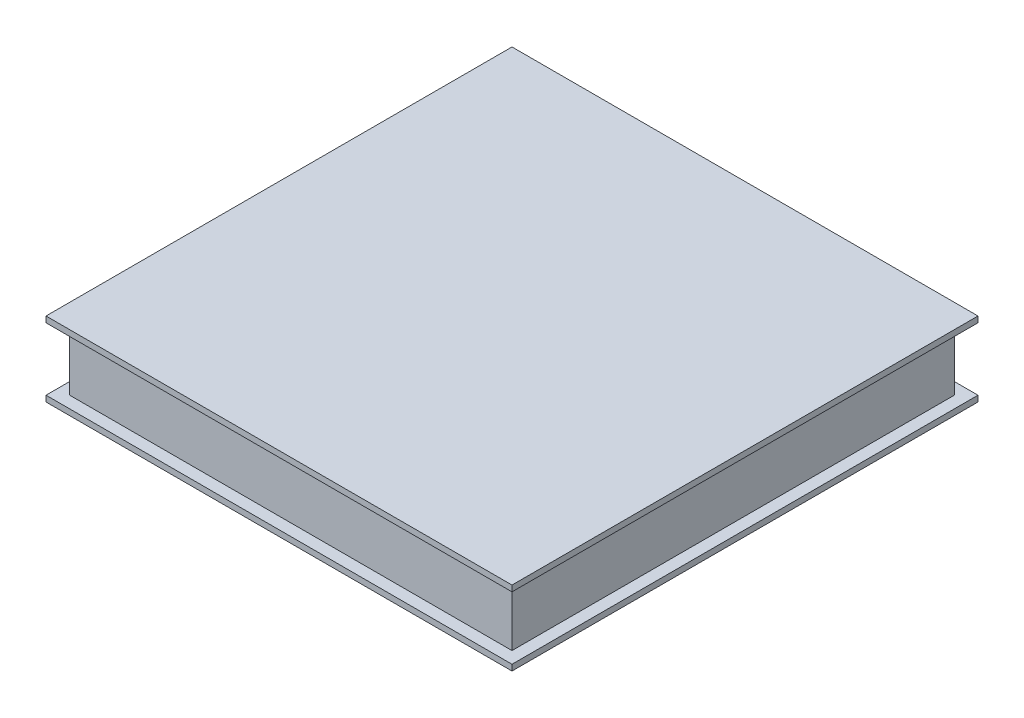
ISO-10303-21;
HEADER;
FILE_DESCRIPTION(('STEP AP214'),'2;1');
FILE_NAME('part.step','',(''),(''),'','','');
FILE_SCHEMA(('AUTOMOTIVE_DESIGN { 1 0 10303 214 1 1 1 1 }'));
ENDSEC;
DATA;
#1=APPLICATION_CONTEXT('core data for automotive mechanical design processes');
#2=APPLICATION_PROTOCOL_DEFINITION('international standard','automotive_design',2000,#1);
#3=PRODUCT_CONTEXT('',#1,'mechanical');
#4=PRODUCT('Part','Part','',(#3));
#5=PRODUCT_RELATED_PRODUCT_CATEGORY('part','',(#4));
#6=PRODUCT_DEFINITION_FORMATION('','',#4);
#7=PRODUCT_DEFINITION_CONTEXT('part definition',#1,'design');
#8=PRODUCT_DEFINITION('design','',#6,#7);
#9=PRODUCT_DEFINITION_SHAPE('','',#8);
#10=(LENGTH_UNIT() NAMED_UNIT(*) SI_UNIT(.MILLI.,.METRE.));
#11=(NAMED_UNIT(*) PLANE_ANGLE_UNIT() SI_UNIT($,.RADIAN.));
#12=(NAMED_UNIT(*) SI_UNIT($,.STERADIAN.) SOLID_ANGLE_UNIT());
#13=UNCERTAINTY_MEASURE_WITH_UNIT(LENGTH_MEASURE(1.E-05),#10,'distance_accuracy_value','');
#14=(GEOMETRIC_REPRESENTATION_CONTEXT(3) GLOBAL_UNCERTAINTY_ASSIGNED_CONTEXT((#13)) GLOBAL_UNIT_ASSIGNED_CONTEXT((#10,
#11,#12)) REPRESENTATION_CONTEXT('',''));
#15=CARTESIAN_POINT('',(0.,0.,0.));
#16=DIRECTION('',(0.,0.,1.));
#17=DIRECTION('',(1.,0.,0.));
#18=AXIS2_PLACEMENT_3D('',#15,#16,#17);
#19=CARTESIAN_POINT('',(-5.53535029976348,1.6002,-5.28977990537365));
#20=DIRECTION('',(-1.,0.,0.));
#21=DIRECTION('',(0.,0.,1.));
#22=AXIS2_PLACEMENT_3D('',#19,#20,#21);
#23=PLANE('',#22);
#24=DIRECTION('',(0.,-1.,0.));
#25=VECTOR('',#24,1.);
#26=CARTESIAN_POINT('',(-5.53535029976348,1.6002,4.20982009462635));
#27=LINE('',#26,#25);
#28=CARTESIAN_POINT('',(-5.53535029976348,1.4732,4.20982009462635));
#29=VERTEX_POINT('',#28);
#30=CARTESIAN_POINT('',(-5.53535029976348,0.127,4.20982009462635));
#31=VERTEX_POINT('',#30);
#32=EDGE_CURVE('E138',#29,#31,#27,.T.);
#33=ORIENTED_EDGE('',*,*,#32,.F.);
#34=DIRECTION('',(0.,0.,1.));
#35=VECTOR('',#34,1.);
#36=CARTESIAN_POINT('',(-5.53535029976348,1.4732,4.20982009462635));
#37=LINE('',#36,#35);
#38=CARTESIAN_POINT('',(-5.53535029976348,1.4732,-5.28977990537365));
#39=VERTEX_POINT('',#38);
#40=EDGE_CURVE('E124',#39,#29,#37,.T.);
#41=ORIENTED_EDGE('',*,*,#40,.F.);
#42=DIRECTION('',(0.,-1.,0.));
#43=VECTOR('',#42,1.);
#44=CARTESIAN_POINT('',(-5.53535029976348,1.6002,-5.28977990537365));
#45=LINE('',#44,#43);
#46=CARTESIAN_POINT('',(-5.53535029976348,0.127,-5.28977990537365));
#47=VERTEX_POINT('',#46);
#48=EDGE_CURVE('E155',#39,#47,#45,.T.);
#49=ORIENTED_EDGE('',*,*,#48,.T.);
#50=DIRECTION('',(0.,0.,1.));
#51=VECTOR('',#50,1.);
#52=CARTESIAN_POINT('',(-5.53535029976348,0.127,-5.28977990537365));
#53=LINE('',#52,#51);
#54=EDGE_CURVE('E145',#47,#31,#53,.T.);
#55=ORIENTED_EDGE('',*,*,#54,.T.);
#56=EDGE_LOOP('',(#33,#41,#49,#55));
#57=FACE_BOUND('',#56,.T.);
#58=ADVANCED_FACE('F36',(#57),#23,.T.);
#59=CARTESIAN_POINT('',(-5.53535029976348,1.6002,4.20982009462635));
#60=DIRECTION('',(0.,0.,1.));
#61=DIRECTION('',(1.,0.,0.));
#62=AXIS2_PLACEMENT_3D('',#59,#60,#61);
#63=PLANE('',#62);
#64=DIRECTION('',(0.,-1.,0.));
#65=VECTOR('',#64,1.);
#66=CARTESIAN_POINT('',(3.96424970023653,1.6002,4.20982009462635));
#67=LINE('',#66,#65);
#68=CARTESIAN_POINT('',(3.96424970023653,1.4732,4.20982009462635));
#69=VERTEX_POINT('',#68);
#70=CARTESIAN_POINT('',(3.96424970023653,0.127,4.20982009462635));
#71=VERTEX_POINT('',#70);
#72=EDGE_CURVE('E140',#69,#71,#67,.T.);
#73=ORIENTED_EDGE('',*,*,#72,.F.);
#74=DIRECTION('',(1.,0.,0.));
#75=VECTOR('',#74,1.);
#76=CARTESIAN_POINT('',(3.96424970023653,1.4732,4.20982009462635));
#77=LINE('',#76,#75);
#78=EDGE_CURVE('E128',#29,#69,#77,.T.);
#79=ORIENTED_EDGE('',*,*,#78,.F.);
#80=ORIENTED_EDGE('',*,*,#32,.T.);
#81=DIRECTION('',(1.,0.,0.));
#82=VECTOR('',#81,1.);
#83=CARTESIAN_POINT('',(-5.53535029976348,0.127,4.20982009462635));
#84=LINE('',#83,#82);
#85=EDGE_CURVE('E147',#31,#71,#84,.T.);
#86=ORIENTED_EDGE('',*,*,#85,.T.);
#87=EDGE_LOOP('',(#73,#79,#80,#86));
#88=FACE_BOUND('',#87,.T.);
#89=ADVANCED_FACE('F136',(#88),#63,.T.);
#90=CARTESIAN_POINT('',(3.96424970023653,1.6002,-5.28977990537365));
#91=DIRECTION('',(1.,0.,0.));
#92=DIRECTION('',(0.,0.,-1.));
#93=AXIS2_PLACEMENT_3D('',#90,#91,#92);
#94=PLANE('',#93);
#95=DIRECTION('',(0.,-1.,0.));
#96=VECTOR('',#95,1.);
#97=CARTESIAN_POINT('',(3.96424970023653,1.6002,-5.28977990537365));
#98=LINE('',#97,#96);
#99=CARTESIAN_POINT('',(3.96424970023653,1.4732,-5.28977990537365));
#100=VERTEX_POINT('',#99);
#101=CARTESIAN_POINT('',(3.96424970023652,0.127,-5.28977990537365));
#102=VERTEX_POINT('',#101);
#103=EDGE_CURVE('E58',#100,#102,#98,.T.);
#104=ORIENTED_EDGE('',*,*,#103,.F.);
#105=DIRECTION('',(0.,0.,-1.));
#106=VECTOR('',#105,1.);
#107=CARTESIAN_POINT('',(3.96424970023653,1.4732,4.20982009462635));
#108=LINE('',#107,#106);
#109=EDGE_CURVE('E51',#69,#100,#108,.T.);
#110=ORIENTED_EDGE('',*,*,#109,.F.);
#111=ORIENTED_EDGE('',*,*,#72,.T.);
#112=DIRECTION('',(0.,0.,-1.));
#113=VECTOR('',#112,1.);
#114=CARTESIAN_POINT('',(3.96424970023652,0.127,-5.28977990537365));
#115=LINE('',#114,#113);
#116=EDGE_CURVE('E159',#71,#102,#115,.T.);
#117=ORIENTED_EDGE('',*,*,#116,.T.);
#118=EDGE_LOOP('',(#104,#110,#111,#117));
#119=FACE_BOUND('',#118,.T.);
#120=ADVANCED_FACE('F221',(#119),#94,.T.);
#121=CARTESIAN_POINT('',(-5.53535029976348,1.6002,-5.28977990537365));
#122=DIRECTION('',(0.,0.,-1.));
#123=DIRECTION('',(-1.,0.,0.));
#124=AXIS2_PLACEMENT_3D('',#121,#122,#123);
#125=PLANE('',#124);
#126=ORIENTED_EDGE('',*,*,#48,.F.);
#127=DIRECTION('',(-1.,0.,0.));
#128=VECTOR('',#127,1.);
#129=CARTESIAN_POINT('',(3.96424970023653,1.4732,-5.28977990537365));
#130=LINE('',#129,#128);
#131=EDGE_CURVE('E129',#100,#39,#130,.T.);
#132=ORIENTED_EDGE('',*,*,#131,.F.);
#133=ORIENTED_EDGE('',*,*,#103,.T.);
#134=DIRECTION('',(-1.,0.,0.));
#135=VECTOR('',#134,1.);
#136=CARTESIAN_POINT('',(-5.53535029976348,0.127,-5.28977990537365));
#137=LINE('',#136,#135);
#138=EDGE_CURVE('E162',#102,#47,#137,.T.);
#139=ORIENTED_EDGE('',*,*,#138,.T.);
#140=EDGE_LOOP('',(#126,#132,#133,#139));
#141=FACE_BOUND('',#140,.T.);
#142=ADVANCED_FACE('F225',(#141),#125,.T.);
#143=CARTESIAN_POINT('',(0.,0.127,0.));
#144=DIRECTION('',(0.,1.,0.));
#145=DIRECTION('',(0.,0.,1.));
#146=AXIS2_PLACEMENT_3D('',#143,#144,#145);
#147=PLANE('',#146);
#148=DIRECTION('',(0.,0.,-1.));
#149=VECTOR('',#148,1.);
#150=CARTESIAN_POINT('',(4.21824970023652,0.127,4.46382009462635));
#151=LINE('',#150,#149);
#152=CARTESIAN_POINT('',(4.21824970023652,0.127,4.46382009462635));
#153=VERTEX_POINT('',#152);
#154=CARTESIAN_POINT('',(4.21824970023652,0.127,-5.54377990537365));
#155=VERTEX_POINT('',#154);
#156=EDGE_CURVE('E165',#153,#155,#151,.T.);
#157=ORIENTED_EDGE('',*,*,#156,.T.);
#158=DIRECTION('',(-1.,0.,0.));
#159=VECTOR('',#158,1.);
#160=CARTESIAN_POINT('',(4.21824970023652,0.127,-5.54377990537365));
#161=LINE('',#160,#159);
#162=CARTESIAN_POINT('',(-5.78935029976348,0.127,-5.54377990537365));
#163=VERTEX_POINT('',#162);
#164=EDGE_CURVE('E168',#155,#163,#161,.T.);
#165=ORIENTED_EDGE('',*,*,#164,.T.);
#166=DIRECTION('',(0.,0.,1.));
#167=VECTOR('',#166,1.);
#168=CARTESIAN_POINT('',(-5.78935029976348,0.127,4.46382009462635));
#169=LINE('',#168,#167);
#170=CARTESIAN_POINT('',(-5.78935029976348,0.127,4.46382009462635));
#171=VERTEX_POINT('',#170);
#172=EDGE_CURVE('E171',#163,#171,#169,.T.);
#173=ORIENTED_EDGE('',*,*,#172,.T.);
#174=DIRECTION('',(1.,0.,0.));
#175=VECTOR('',#174,1.);
#176=CARTESIAN_POINT('',(4.21824970023652,0.127,4.46382009462635));
#177=LINE('',#176,#175);
#178=EDGE_CURVE('E173',#171,#153,#177,.T.);
#179=ORIENTED_EDGE('',*,*,#178,.T.);
#180=EDGE_LOOP('',(#157,#165,#173,#179));
#181=FACE_BOUND('',#180,.T.);
#182=ORIENTED_EDGE('',*,*,#85,.F.);
#183=ORIENTED_EDGE('',*,*,#54,.F.);
#184=ORIENTED_EDGE('',*,*,#138,.F.);
#185=ORIENTED_EDGE('',*,*,#116,.F.);
#186=EDGE_LOOP('',(#182,#183,#184,#185));
#187=FACE_BOUND('',#186,.T.);
#188=ADVANCED_FACE('F207',(#181,#187),#147,.T.);
#189=CARTESIAN_POINT('',(0.,0.,0.));
#190=DIRECTION('',(0.,1.,0.));
#191=DIRECTION('',(0.,0.,1.));
#192=AXIS2_PLACEMENT_3D('',#189,#190,#191);
#193=PLANE('',#192);
#194=DIRECTION('',(0.,0.,-1.));
#195=VECTOR('',#194,1.);
#196=CARTESIAN_POINT('',(4.21824970023652,0.,4.46382009462635));
#197=LINE('',#196,#195);
#198=CARTESIAN_POINT('',(4.21824970023652,0.,4.46382009462635));
#199=VERTEX_POINT('',#198);
#200=CARTESIAN_POINT('',(4.21824970023652,0.,-5.54377990537365));
#201=VERTEX_POINT('',#200);
#202=EDGE_CURVE('E164',#199,#201,#197,.T.);
#203=ORIENTED_EDGE('',*,*,#202,.F.);
#204=DIRECTION('',(1.,0.,0.));
#205=VECTOR('',#204,1.);
#206=CARTESIAN_POINT('',(4.21824970023652,0.,4.46382009462635));
#207=LINE('',#206,#205);
#208=CARTESIAN_POINT('',(-5.78935029976348,0.,4.46382009462635));
#209=VERTEX_POINT('',#208);
#210=EDGE_CURVE('E169',#209,#199,#207,.T.);
#211=ORIENTED_EDGE('',*,*,#210,.F.);
#212=DIRECTION('',(0.,0.,1.));
#213=VECTOR('',#212,1.);
#214=CARTESIAN_POINT('',(-5.78935029976348,0.,4.46382009462635));
#215=LINE('',#214,#213);
#216=CARTESIAN_POINT('',(-5.78935029976348,0.,-5.54377990537365));
#217=VERTEX_POINT('',#216);
#218=EDGE_CURVE('E180',#217,#209,#215,.T.);
#219=ORIENTED_EDGE('',*,*,#218,.F.);
#220=DIRECTION('',(-1.,0.,0.));
#221=VECTOR('',#220,1.);
#222=CARTESIAN_POINT('',(4.21824970023652,0.,-5.54377990537365));
#223=LINE('',#222,#221);
#224=EDGE_CURVE('E178',#201,#217,#223,.T.);
#225=ORIENTED_EDGE('',*,*,#224,.F.);
#226=EDGE_LOOP('',(#203,#211,#219,#225));
#227=FACE_BOUND('',#226,.T.);
#228=ADVANCED_FACE('F198',(#227),#193,.F.);
#229=CARTESIAN_POINT('',(4.21824970023652,0.127,4.46382009462635));
#230=DIRECTION('',(-1.,0.,0.));
#231=DIRECTION('',(0.,0.,1.));
#232=AXIS2_PLACEMENT_3D('',#229,#230,#231);
#233=PLANE('',#232);
#234=ORIENTED_EDGE('',*,*,#202,.T.);
#235=DIRECTION('',(0.,-1.,0.));
#236=VECTOR('',#235,1.);
#237=CARTESIAN_POINT('',(4.21824970023652,0.127,-5.54377990537365));
#238=LINE('',#237,#236);
#239=EDGE_CURVE('E11',#155,#201,#238,.T.);
#240=ORIENTED_EDGE('',*,*,#239,.F.);
#241=ORIENTED_EDGE('',*,*,#156,.F.);
#242=DIRECTION('',(0.,-1.,0.));
#243=VECTOR('',#242,1.);
#244=CARTESIAN_POINT('',(4.21824970023652,0.127,4.46382009462635));
#245=LINE('',#244,#243);
#246=EDGE_CURVE('E175',#153,#199,#245,.T.);
#247=ORIENTED_EDGE('',*,*,#246,.T.);
#248=EDGE_LOOP('',(#234,#240,#241,#247));
#249=FACE_BOUND('',#248,.T.);
#250=ADVANCED_FACE('F38',(#249),#233,.F.);
#251=CARTESIAN_POINT('',(4.21824970023652,0.127,-5.54377990537365));
#252=DIRECTION('',(0.,0.,1.));
#253=DIRECTION('',(1.,0.,0.));
#254=AXIS2_PLACEMENT_3D('',#251,#252,#253);
#255=PLANE('',#254);
#256=ORIENTED_EDGE('',*,*,#224,.T.);
#257=DIRECTION('',(0.,-1.,0.));
#258=VECTOR('',#257,1.);
#259=CARTESIAN_POINT('',(-5.78935029976348,0.127,-5.54377990537365));
#260=LINE('',#259,#258);
#261=EDGE_CURVE('E44',#163,#217,#260,.T.);
#262=ORIENTED_EDGE('',*,*,#261,.F.);
#263=ORIENTED_EDGE('',*,*,#164,.F.);
#264=ORIENTED_EDGE('',*,*,#239,.T.);
#265=EDGE_LOOP('',(#256,#262,#263,#264));
#266=FACE_BOUND('',#265,.T.);
#267=ADVANCED_FACE('F209',(#266),#255,.F.);
#268=CARTESIAN_POINT('',(-5.78935029976348,0.127,4.46382009462635));
#269=DIRECTION('',(1.,0.,0.));
#270=DIRECTION('',(0.,0.,-1.));
#271=AXIS2_PLACEMENT_3D('',#268,#269,#270);
#272=PLANE('',#271);
#273=ORIENTED_EDGE('',*,*,#218,.T.);
#274=DIRECTION('',(0.,-1.,0.));
#275=VECTOR('',#274,1.);
#276=CARTESIAN_POINT('',(-5.78935029976348,0.127,4.46382009462635));
#277=LINE('',#276,#275);
#278=EDGE_CURVE('E185',#171,#209,#277,.T.);
#279=ORIENTED_EDGE('',*,*,#278,.F.);
#280=ORIENTED_EDGE('',*,*,#172,.F.);
#281=ORIENTED_EDGE('',*,*,#261,.T.);
#282=EDGE_LOOP('',(#273,#279,#280,#281));
#283=FACE_BOUND('',#282,.T.);
#284=ADVANCED_FACE('F192',(#283),#272,.F.);
#285=CARTESIAN_POINT('',(4.21824970023652,0.127,4.46382009462635));
#286=DIRECTION('',(0.,0.,-1.));
#287=DIRECTION('',(-1.,0.,0.));
#288=AXIS2_PLACEMENT_3D('',#285,#286,#287);
#289=PLANE('',#288);
#290=ORIENTED_EDGE('',*,*,#210,.T.);
#291=ORIENTED_EDGE('',*,*,#246,.F.);
#292=ORIENTED_EDGE('',*,*,#178,.F.);
#293=ORIENTED_EDGE('',*,*,#278,.T.);
#294=EDGE_LOOP('',(#290,#291,#292,#293));
#295=FACE_BOUND('',#294,.T.);
#296=ADVANCED_FACE('F201',(#295),#289,.F.);
#297=CARTESIAN_POINT('',(-5.78935029976348,1.4732,-5.54377990537365));
#298=DIRECTION('',(-1.,0.,0.));
#299=DIRECTION('',(0.,0.,1.));
#300=AXIS2_PLACEMENT_3D('',#297,#298,#299);
#301=PLANE('',#300);
#302=DIRECTION('',(0.,0.,1.));
#303=VECTOR('',#302,1.);
#304=CARTESIAN_POINT('',(-5.78935029976348,1.6002,-5.54377990537365));
#305=LINE('',#304,#303);
#306=CARTESIAN_POINT('',(-5.78935029976348,1.6002,-5.54377990537365));
#307=VERTEX_POINT('',#306);
#308=CARTESIAN_POINT('',(-5.78935029976348,1.6002,4.46382009462635));
#309=VERTEX_POINT('',#308);
#310=EDGE_CURVE('E141',#307,#309,#305,.T.);
#311=ORIENTED_EDGE('',*,*,#310,.F.);
#312=DIRECTION('',(0.,1.,0.));
#313=VECTOR('',#312,1.);
#314=CARTESIAN_POINT('',(-5.78935029976348,1.4732,-5.54377990537365));
#315=LINE('',#314,#313);
#316=CARTESIAN_POINT('',(-5.78935029976348,1.4732,-5.54377990537365));
#317=VERTEX_POINT('',#316);
#318=EDGE_CURVE('E156',#317,#307,#315,.T.);
#319=ORIENTED_EDGE('',*,*,#318,.F.);
#320=DIRECTION('',(0.,0.,1.));
#321=VECTOR('',#320,1.);
#322=CARTESIAN_POINT('',(-5.78935029976348,1.4732,-5.54377990537365));
#323=LINE('',#322,#321);
#324=CARTESIAN_POINT('',(-5.78935029976348,1.4732,4.46382009462635));
#325=VERTEX_POINT('',#324);
#326=EDGE_CURVE('E262',#317,#325,#323,.T.);
#327=ORIENTED_EDGE('',*,*,#326,.T.);
#328=DIRECTION('',(0.,1.,0.));
#329=VECTOR('',#328,1.);
#330=CARTESIAN_POINT('',(-5.78935029976348,1.4732,4.46382009462635));
#331=LINE('',#330,#329);
#332=EDGE_CURVE('E151',#325,#309,#331,.T.);
#333=ORIENTED_EDGE('',*,*,#332,.T.);
#334=EDGE_LOOP('',(#311,#319,#327,#333));
#335=FACE_BOUND('',#334,.T.);
#336=ADVANCED_FACE('F232',(#335),#301,.T.);
#337=CARTESIAN_POINT('',(-5.78935029976348,1.4732,-5.54377990537365));
#338=DIRECTION('',(0.,0.,-1.));
#339=DIRECTION('',(-1.,0.,0.));
#340=AXIS2_PLACEMENT_3D('',#337,#338,#339);
#341=PLANE('',#340);
#342=DIRECTION('',(-1.,0.,0.));
#343=VECTOR('',#342,1.);
#344=CARTESIAN_POINT('',(-5.78935029976348,1.6002,-5.54377990537365));
#345=LINE('',#344,#343);
#346=CARTESIAN_POINT('',(4.21824970023652,1.6002,-5.54377990537365));
#347=VERTEX_POINT('',#346);
#348=EDGE_CURVE('E266',#347,#307,#345,.T.);
#349=ORIENTED_EDGE('',*,*,#348,.F.);
#350=DIRECTION('',(0.,1.,0.));
#351=VECTOR('',#350,1.);
#352=CARTESIAN_POINT('',(4.21824970023652,1.4732,-5.54377990537365));
#353=LINE('',#352,#351);
#354=CARTESIAN_POINT('',(4.21824970023652,1.4732,-5.54377990537365));
#355=VERTEX_POINT('',#354);
#356=EDGE_CURVE('E286',#355,#347,#353,.T.);
#357=ORIENTED_EDGE('',*,*,#356,.F.);
#358=DIRECTION('',(-1.,0.,0.));
#359=VECTOR('',#358,1.);
#360=CARTESIAN_POINT('',(-5.78935029976348,1.4732,-5.54377990537365));
#361=LINE('',#360,#359);
#362=EDGE_CURVE('E272',#355,#317,#361,.T.);
#363=ORIENTED_EDGE('',*,*,#362,.T.);
#364=ORIENTED_EDGE('',*,*,#318,.T.);
#365=EDGE_LOOP('',(#349,#357,#363,#364));
#366=FACE_BOUND('',#365,.T.);
#367=ADVANCED_FACE('F236',(#366),#341,.T.);
#368=CARTESIAN_POINT('',(4.21824970023652,1.4732,-5.54377990537365));
#369=DIRECTION('',(1.,0.,0.));
#370=DIRECTION('',(0.,0.,-1.));
#371=AXIS2_PLACEMENT_3D('',#368,#369,#370);
#372=PLANE('',#371);
#373=DIRECTION('',(0.,0.,-1.));
#374=VECTOR('',#373,1.);
#375=CARTESIAN_POINT('',(4.21824970023652,1.6002,-5.54377990537365));
#376=LINE('',#375,#374);
#377=CARTESIAN_POINT('',(4.21824970023652,1.6002,4.46382009462635));
#378=VERTEX_POINT('',#377);
#379=EDGE_CURVE('E280',#378,#347,#376,.T.);
#380=ORIENTED_EDGE('',*,*,#379,.F.);
#381=DIRECTION('',(0.,1.,0.));
#382=VECTOR('',#381,1.);
#383=CARTESIAN_POINT('',(4.21824970023652,1.4732,4.46382009462635));
#384=LINE('',#383,#382);
#385=CARTESIAN_POINT('',(4.21824970023652,1.4732,4.46382009462635));
#386=VERTEX_POINT('',#385);
#387=EDGE_CURVE('E287',#386,#378,#384,.T.);
#388=ORIENTED_EDGE('',*,*,#387,.F.);
#389=DIRECTION('',(0.,0.,-1.));
#390=VECTOR('',#389,1.);
#391=CARTESIAN_POINT('',(4.21824970023652,1.4732,-5.54377990537365));
#392=LINE('',#391,#390);
#393=EDGE_CURVE('E269',#386,#355,#392,.T.);
#394=ORIENTED_EDGE('',*,*,#393,.T.);
#395=ORIENTED_EDGE('',*,*,#356,.T.);
#396=EDGE_LOOP('',(#380,#388,#394,#395));
#397=FACE_BOUND('',#396,.T.);
#398=ADVANCED_FACE('F242',(#397),#372,.T.);
#399=CARTESIAN_POINT('',(-5.78935029976348,1.4732,4.46382009462635));
#400=DIRECTION('',(0.,0.,1.));
#401=DIRECTION('',(1.,0.,0.));
#402=AXIS2_PLACEMENT_3D('',#399,#400,#401);
#403=PLANE('',#402);
#404=DIRECTION('',(1.,0.,0.));
#405=VECTOR('',#404,1.);
#406=CARTESIAN_POINT('',(-5.78935029976348,1.6002,4.46382009462635));
#407=LINE('',#406,#405);
#408=EDGE_CURVE('E277',#309,#378,#407,.T.);
#409=ORIENTED_EDGE('',*,*,#408,.F.);
#410=ORIENTED_EDGE('',*,*,#332,.F.);
#411=DIRECTION('',(1.,0.,0.));
#412=VECTOR('',#411,1.);
#413=CARTESIAN_POINT('',(-5.78935029976348,1.4732,4.46382009462635));
#414=LINE('',#413,#412);
#415=EDGE_CURVE('E265',#325,#386,#414,.T.);
#416=ORIENTED_EDGE('',*,*,#415,.T.);
#417=ORIENTED_EDGE('',*,*,#387,.T.);
#418=EDGE_LOOP('',(#409,#410,#416,#417));
#419=FACE_BOUND('',#418,.T.);
#420=ADVANCED_FACE('F248',(#419),#403,.T.);
#421=CARTESIAN_POINT('',(0.,1.4732,0.));
#422=DIRECTION('',(0.,1.,0.));
#423=DIRECTION('',(0.,0.,1.));
#424=AXIS2_PLACEMENT_3D('',#421,#422,#423);
#425=PLANE('',#424);
#426=ORIENTED_EDGE('',*,*,#78,.T.);
#427=ORIENTED_EDGE('',*,*,#109,.T.);
#428=ORIENTED_EDGE('',*,*,#131,.T.);
#429=ORIENTED_EDGE('',*,*,#40,.T.);
#430=EDGE_LOOP('',(#426,#427,#428,#429));
#431=FACE_BOUND('',#430,.T.);
#432=ORIENTED_EDGE('',*,*,#326,.F.);
#433=ORIENTED_EDGE('',*,*,#362,.F.);
#434=ORIENTED_EDGE('',*,*,#393,.F.);
#435=ORIENTED_EDGE('',*,*,#415,.F.);
#436=EDGE_LOOP('',(#432,#433,#434,#435));
#437=FACE_BOUND('',#436,.T.);
#438=ADVANCED_FACE('F126',(#431,#437),#425,.F.);
#439=CARTESIAN_POINT('',(0.,1.6002,0.));
#440=DIRECTION('',(0.,1.,0.));
#441=DIRECTION('',(0.,0.,1.));
#442=AXIS2_PLACEMENT_3D('',#439,#440,#441);
#443=PLANE('',#442);
#444=ORIENTED_EDGE('',*,*,#310,.T.);
#445=ORIENTED_EDGE('',*,*,#408,.T.);
#446=ORIENTED_EDGE('',*,*,#379,.T.);
#447=ORIENTED_EDGE('',*,*,#348,.T.);
#448=EDGE_LOOP('',(#444,#445,#446,#447));
#449=FACE_BOUND('',#448,.T.);
#450=ADVANCED_FACE('F250',(#449),#443,.T.);
#451=CLOSED_SHELL('',(#58,#89,#120,#142,#188,#228,#250,#267,#284,#296,#336,#367,#398,#420,#438,#450));
#452=MANIFOLD_SOLID_BREP('B2',#451);
#453=ADVANCED_BREP_SHAPE_REPRESENTATION('',(#18,#452),#14);
#454=SHAPE_DEFINITION_REPRESENTATION(#9,#453);
ENDSEC;
END-ISO-10303-21;
